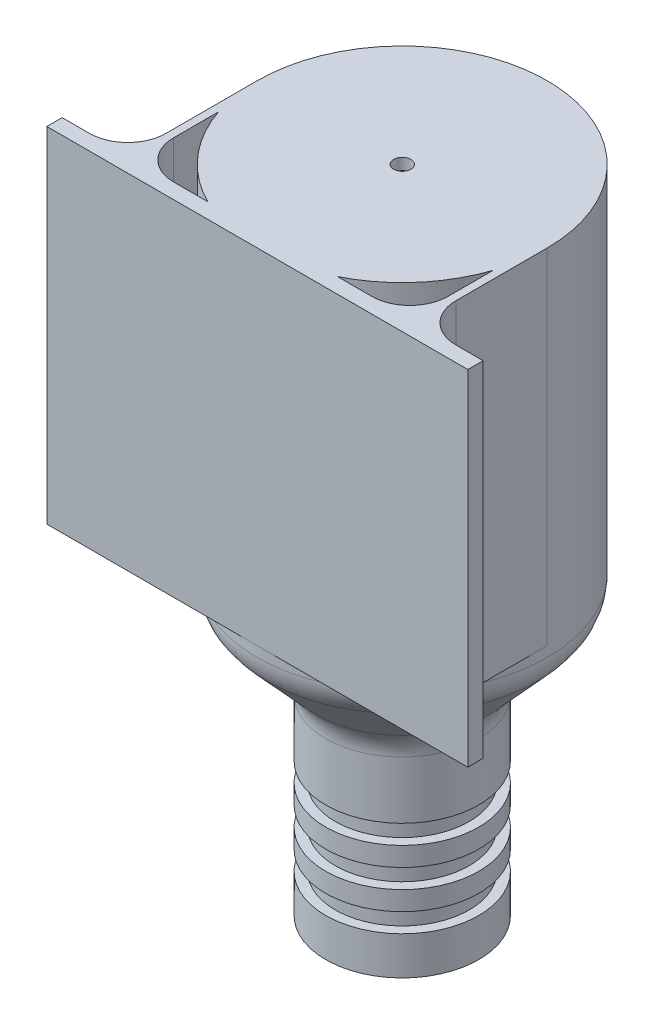
ISO-10303-21;
HEADER;
FILE_DESCRIPTION(('STEP AP214'),'2;1');
FILE_NAME('part.step','',(''),(''),'','','');
FILE_SCHEMA(('AUTOMOTIVE_DESIGN { 1 0 10303 214 1 1 1 1 }'));
ENDSEC;
DATA;
#1=APPLICATION_CONTEXT('core data for automotive mechanical design processes');
#2=APPLICATION_PROTOCOL_DEFINITION('international standard','automotive_design',2000,#1);
#3=PRODUCT_CONTEXT('',#1,'mechanical');
#4=PRODUCT('Part','Part','',(#3));
#5=PRODUCT_RELATED_PRODUCT_CATEGORY('part','',(#4));
#6=PRODUCT_DEFINITION_FORMATION('','',#4);
#7=PRODUCT_DEFINITION_CONTEXT('part definition',#1,'design');
#8=PRODUCT_DEFINITION('design','',#6,#7);
#9=PRODUCT_DEFINITION_SHAPE('','',#8);
#10=(LENGTH_UNIT() NAMED_UNIT(*) SI_UNIT(.MILLI.,.METRE.));
#11=(NAMED_UNIT(*) PLANE_ANGLE_UNIT() SI_UNIT($,.RADIAN.));
#12=(NAMED_UNIT(*) SI_UNIT($,.STERADIAN.) SOLID_ANGLE_UNIT());
#13=UNCERTAINTY_MEASURE_WITH_UNIT(LENGTH_MEASURE(1.E-05),#10,'distance_accuracy_value','');
#14=(GEOMETRIC_REPRESENTATION_CONTEXT(3) GLOBAL_UNCERTAINTY_ASSIGNED_CONTEXT((#13)) GLOBAL_UNIT_ASSIGNED_CONTEXT((#10,
#11,#12)) REPRESENTATION_CONTEXT('',''));
#15=CARTESIAN_POINT('',(0.,0.,0.));
#16=DIRECTION('',(0.,0.,1.));
#17=DIRECTION('',(1.,0.,0.));
#18=AXIS2_PLACEMENT_3D('',#15,#16,#17);
#19=CARTESIAN_POINT('',(0.,-59.8967644363856,0.));
#20=DIRECTION('',(0.,1.,0.));
#21=DIRECTION('',(-1.,0.,0.));
#22=AXIS2_PLACEMENT_3D('',#19,#20,#21);
#23=CYLINDRICAL_SURFACE('',#22,35.8731013826736);
#24=CARTESIAN_POINT('',(0.,-129.659355932698,0.));
#25=DIRECTION('',(0.,1.,0.));
#26=DIRECTION('',(-1.,0.,0.));
#27=AXIS2_PLACEMENT_3D('',#24,#25,#26);
#28=CIRCLE('',#27,35.8731013826736);
#29=CARTESIAN_POINT('',(-35.8731013826736,-129.659355932698,0.));
#30=VERTEX_POINT('',#29);
#31=EDGE_CURVE('E430',#30,#30,#28,.T.);
#32=ORIENTED_EDGE('',*,*,#31,.F.);
#33=EDGE_LOOP('',(#32));
#34=FACE_BOUND('',#33,.T.);
#35=CARTESIAN_POINT('',(0.,-57.4112303872848,0.));
#36=DIRECTION('',(0.,1.,0.));
#37=DIRECTION('',(-1.,0.,0.));
#38=AXIS2_PLACEMENT_3D('',#35,#36,#37);
#39=CIRCLE('',#38,35.8731013826736);
#40=CARTESIAN_POINT('',(-35.8731013826736,-57.4112303872848,0.));
#41=VERTEX_POINT('',#40);
#42=EDGE_CURVE('E206',#41,#41,#39,.T.);
#43=ORIENTED_EDGE('',*,*,#42,.T.);
#44=EDGE_LOOP('',(#43));
#45=FACE_BOUND('',#44,.T.);
#46=ADVANCED_FACE('F45',(#34,#45),#23,.F.);
#47=CARTESIAN_POINT('',(0.,-59.8967644363856,0.));
#48=DIRECTION('',(0.,1.,0.));
#49=DIRECTION('',(-1.,0.,0.));
#50=AXIS2_PLACEMENT_3D('',#47,#48,#49);
#51=CYLINDRICAL_SURFACE('',#50,37.8731013826736);
#52=CARTESIAN_POINT('',(0.,-54.4112303872848,0.));
#53=DIRECTION('',(0.,1.,0.));
#54=DIRECTION('',(-1.,0.,0.));
#55=AXIS2_PLACEMENT_3D('',#52,#53,#54);
#56=CIRCLE('',#55,37.8731013826736);
#57=CARTESIAN_POINT('',(37.8731013826737,-54.4112303872848,0.));
#58=VERTEX_POINT('',#57);
#59=CARTESIAN_POINT('',(-37.8731013826736,-54.4112303872848,-1.21089074646467E-13));
#60=VERTEX_POINT('',#59);
#61=EDGE_CURVE('E434',#58,#60,#56,.T.);
#62=ORIENTED_EDGE('',*,*,#61,.F.);
#63=DIRECTION('',(0.,1.,0.));
#64=VECTOR('',#63,1.);
#65=CARTESIAN_POINT('',(37.8731013826736,-144.411230387285,1.38777878078144E-13));
#66=LINE('',#65,#64);
#67=CARTESIAN_POINT('',(37.8731013826736,-144.411230387285,1.38777878078144E-13));
#68=VERTEX_POINT('',#67);
#69=EDGE_CURVE('E61',#68,#58,#66,.T.);
#70=ORIENTED_EDGE('',*,*,#69,.F.);
#71=CARTESIAN_POINT('',(0.,-144.411230387285,0.));
#72=DIRECTION('',(0.,1.,0.));
#73=DIRECTION('',(-1.,0.,0.));
#74=AXIS2_PLACEMENT_3D('',#71,#72,#73);
#75=CIRCLE('',#74,37.8731013826736);
#76=CARTESIAN_POINT('',(35.8731013826737,-144.411230387285,12.1446451381127));
#77=VERTEX_POINT('',#76);
#78=EDGE_CURVE('E183',#77,#68,#75,.T.);
#79=ORIENTED_EDGE('',*,*,#78,.F.);
#80=DIRECTION('',(0.,1.,0.));
#81=VECTOR('',#80,1.);
#82=CARTESIAN_POINT('',(35.8731013826737,-144.411230387285,12.1446451381127));
#83=LINE('',#82,#81);
#84=CARTESIAN_POINT('',(35.8731013826737,-54.4112303872848,12.1446451381127));
#85=VERTEX_POINT('',#84);
#86=EDGE_CURVE('E352',#77,#85,#83,.T.);
#87=ORIENTED_EDGE('',*,*,#86,.T.);
#88=CARTESIAN_POINT('',(16.940626052817,-54.4112303872848,33.8731013826737));
#89=VERTEX_POINT('',#88);
#90=EDGE_CURVE('E438',#89,#85,#56,.T.);
#91=ORIENTED_EDGE('',*,*,#90,.F.);
#92=DIRECTION('',(0.,1.,0.));
#93=VECTOR('',#92,1.);
#94=CARTESIAN_POINT('',(16.940626052817,-59.8967644363856,33.8731013826737));
#95=LINE('',#94,#93);
#96=CARTESIAN_POINT('',(16.940626052817,-144.411230387285,33.8731013826737));
#97=VERTEX_POINT('',#96);
#98=EDGE_CURVE('E311',#89,#97,#95,.F.);
#99=ORIENTED_EDGE('',*,*,#98,.T.);
#100=CARTESIAN_POINT('',(0.,-144.411230387285,0.));
#101=DIRECTION('',(0.,1.,0.));
#102=DIRECTION('',(-1.,0.,0.));
#103=AXIS2_PLACEMENT_3D('',#100,#101,#102);
#104=CIRCLE('',#103,37.8731013826736);
#105=CARTESIAN_POINT('',(0.,-144.411230387285,37.8731013826737));
#106=VERTEX_POINT('',#105);
#107=EDGE_CURVE('E54',#106,#97,#104,.T.);
#108=ORIENTED_EDGE('',*,*,#107,.F.);
#109=CARTESIAN_POINT('',(-16.9406260528171,-144.411230387285,33.8731013826736));
#110=VERTEX_POINT('',#109);
#111=EDGE_CURVE('E11',#110,#106,#104,.T.);
#112=ORIENTED_EDGE('',*,*,#111,.F.);
#113=DIRECTION('',(0.,1.,0.));
#114=VECTOR('',#113,1.);
#115=CARTESIAN_POINT('',(-16.9406260528172,-59.8967644363856,33.8731013826736));
#116=LINE('',#115,#114);
#117=CARTESIAN_POINT('',(-16.9406260528171,-54.4112303872848,33.8731013826736));
#118=VERTEX_POINT('',#117);
#119=EDGE_CURVE('E359',#110,#118,#116,.T.);
#120=ORIENTED_EDGE('',*,*,#119,.T.);
#121=CARTESIAN_POINT('',(-35.8731013826736,-54.4112303872848,12.144645138113));
#122=VERTEX_POINT('',#121);
#123=EDGE_CURVE('E439',#122,#118,#56,.T.);
#124=ORIENTED_EDGE('',*,*,#123,.F.);
#125=DIRECTION('',(0.,1.,0.));
#126=VECTOR('',#125,1.);
#127=CARTESIAN_POINT('',(-35.8731013826736,-144.411230387285,12.144645138113));
#128=LINE('',#127,#126);
#129=CARTESIAN_POINT('',(-35.8731013826736,-144.411230387285,12.144645138113));
#130=VERTEX_POINT('',#129);
#131=EDGE_CURVE('E335',#130,#122,#128,.T.);
#132=ORIENTED_EDGE('',*,*,#131,.F.);
#133=CARTESIAN_POINT('',(0.,-144.411230387285,0.));
#134=DIRECTION('',(0.,1.,0.));
#135=DIRECTION('',(-1.,0.,0.));
#136=AXIS2_PLACEMENT_3D('',#133,#134,#135);
#137=CIRCLE('',#136,37.8731013826736);
#138=CARTESIAN_POINT('',(-37.8731013826736,-144.411230387285,-1.21089074646467E-13));
#139=VERTEX_POINT('',#138);
#140=EDGE_CURVE('E232',#139,#130,#137,.T.);
#141=ORIENTED_EDGE('',*,*,#140,.F.);
#142=DIRECTION('',(0.,1.,0.));
#143=VECTOR('',#142,1.);
#144=CARTESIAN_POINT('',(-37.8731013826736,-144.411230387285,-1.21089074646467E-13));
#145=LINE('',#144,#143);
#146=EDGE_CURVE('E332',#139,#60,#145,.T.);
#147=ORIENTED_EDGE('',*,*,#146,.T.);
#148=EDGE_LOOP('',(#62,#70,#79,#87,#91,#99,#108,#112,#120,#124,#132,#141,#147));
#149=FACE_BOUND('',#148,.T.);
#150=CARTESIAN_POINT('',(0.,-147.078195730755,0.));
#151=DIRECTION('',(0.,1.,0.));
#152=DIRECTION('',(-1.,0.,0.));
#153=AXIS2_PLACEMENT_3D('',#150,#151,#152);
#154=CIRCLE('',#153,37.8731013826736);
#155=CARTESIAN_POINT('',(-37.8731013826736,-147.078195730755,0.));
#156=VERTEX_POINT('',#155);
#157=EDGE_CURVE('E440',#156,#156,#154,.T.);
#158=ORIENTED_EDGE('',*,*,#157,.T.);
#159=EDGE_LOOP('',(#158));
#160=FACE_BOUND('',#159,.T.);
#161=ADVANCED_FACE('F475',(#149,#160),#51,.T.);
#162=CARTESIAN_POINT('',(0.,-59.8967644363856,0.));
#163=DIRECTION('',(0.,1.,0.));
#164=DIRECTION('',(-1.,0.,0.));
#165=AXIS2_PLACEMENT_3D('',#162,#163,#164);
#166=CYLINDRICAL_SURFACE('',#165,20.);
#167=CARTESIAN_POINT('',(0.,-174.411230387285,0.));
#168=DIRECTION('',(0.,1.,0.));
#169=DIRECTION('',(-1.,0.,0.));
#170=AXIS2_PLACEMENT_3D('',#167,#168,#169);
#171=CIRCLE('',#170,20.);
#172=CARTESIAN_POINT('',(-20.,-174.411230387285,0.));
#173=VERTEX_POINT('',#172);
#174=EDGE_CURVE('E451',#173,#173,#171,.T.);
#175=ORIENTED_EDGE('',*,*,#174,.F.);
#176=EDGE_LOOP('',(#175));
#177=FACE_BOUND('',#176,.T.);
#178=CARTESIAN_POINT('',(0.,-189.411230387285,0.));
#179=DIRECTION('',(0.,1.,0.));
#180=DIRECTION('',(-1.,0.,0.));
#181=AXIS2_PLACEMENT_3D('',#178,#179,#180);
#182=CIRCLE('',#181,20.);
#183=CARTESIAN_POINT('',(-20.,-189.411230387285,0.));
#184=VERTEX_POINT('',#183);
#185=EDGE_CURVE('E362',#184,#184,#182,.T.);
#186=ORIENTED_EDGE('',*,*,#185,.T.);
#187=EDGE_LOOP('',(#186));
#188=FACE_BOUND('',#187,.T.);
#189=ADVANCED_FACE('F47',(#177,#188),#166,.T.);
#190=CARTESIAN_POINT('',(0.,-174.411230387285,0.));
#191=DIRECTION('',(0.,1.,0.));
#192=DIRECTION('',(-1.,0.,0.));
#193=AXIS2_PLACEMENT_3D('',#190,#191,#192);
#194=TOROIDAL_SURFACE('',#193,30.,9.99999999999999);
#195=CARTESIAN_POINT('',(0.,-167.668738262499,0.));
#196=DIRECTION('',(0.,1.,0.));
#197=DIRECTION('',(-1.,0.,0.));
#198=AXIS2_PLACEMENT_3D('',#195,#196,#197);
#199=CIRCLE('',#198,22.6149610734129);
#200=CARTESIAN_POINT('',(-22.6149610734129,-167.668738262499,0.));
#201=VERTEX_POINT('',#200);
#202=EDGE_CURVE('E448',#201,#201,#199,.T.);
#203=ORIENTED_EDGE('',*,*,#202,.F.);
#204=EDGE_LOOP('',(#203));
#205=FACE_BOUND('',#204,.T.);
#206=ORIENTED_EDGE('',*,*,#174,.T.);
#207=EDGE_LOOP('',(#206));
#208=FACE_BOUND('',#207,.T.);
#209=ADVANCED_FACE('F561',(#205,#208),#194,.F.);
#210=CARTESIAN_POINT('',(0.,-167.668738262499,0.));
#211=DIRECTION('',(0.,1.,0.));
#212=DIRECTION('',(-1.,0.,0.));
#213=AXIS2_PLACEMENT_3D('',#210,#211,#212);
#214=CONICAL_SURFACE('',#213,22.6149610734129,0.739947596653468);
#215=CARTESIAN_POINT('',(0.,-153.82068785554,0.));
#216=DIRECTION('',(0.,1.,0.));
#217=DIRECTION('',(-1.,0.,0.));
#218=AXIS2_PLACEMENT_3D('',#215,#216,#217);
#219=CIRCLE('',#218,35.2581403092607);
#220=CARTESIAN_POINT('',(-35.2581403092606,-153.82068785554,0.));
#221=VERTEX_POINT('',#220);
#222=EDGE_CURVE('E444',#221,#221,#219,.T.);
#223=ORIENTED_EDGE('',*,*,#222,.F.);
#224=EDGE_LOOP('',(#223));
#225=FACE_BOUND('',#224,.T.);
#226=ORIENTED_EDGE('',*,*,#202,.T.);
#227=EDGE_LOOP('',(#226));
#228=FACE_BOUND('',#227,.T.);
#229=ADVANCED_FACE('F558',(#225,#228),#214,.T.);
#230=CARTESIAN_POINT('',(0.,-147.078195730755,0.));
#231=DIRECTION('',(0.,1.,0.));
#232=DIRECTION('',(-1.,0.,0.));
#233=AXIS2_PLACEMENT_3D('',#230,#231,#232);
#234=TOROIDAL_SURFACE('',#233,27.8731013826736,10.);
#235=ORIENTED_EDGE('',*,*,#157,.F.);
#236=EDGE_LOOP('',(#235));
#237=FACE_BOUND('',#236,.T.);
#238=ORIENTED_EDGE('',*,*,#222,.T.);
#239=EDGE_LOOP('',(#238));
#240=FACE_BOUND('',#239,.T.);
#241=ADVANCED_FACE('F554',(#237,#240),#234,.T.);
#242=CARTESIAN_POINT('',(0.,-54.4112303872848,0.));
#243=DIRECTION('',(0.,-1.,0.));
#244=DIRECTION('',(1.,0.,0.));
#245=AXIS2_PLACEMENT_3D('',#242,#243,#244);
#246=PLANE('',#245);
#247=ORIENTED_EDGE('',*,*,#90,.T.);
#248=DIRECTION('',(0.,0.,-1.));
#249=VECTOR('',#248,1.);
#250=CARTESIAN_POINT('',(35.8731013826737,-54.4112303872848,0.));
#251=LINE('',#250,#249);
#252=CARTESIAN_POINT('',(35.8731013826737,-54.4112303872848,23.8731013826736));
#253=VERTEX_POINT('',#252);
#254=EDGE_CURVE('E267',#253,#85,#251,.T.);
#255=ORIENTED_EDGE('',*,*,#254,.F.);
#256=CARTESIAN_POINT('',(25.8731013826737,-54.4112303872848,23.8731013826737));
#257=DIRECTION('',(0.,1.,0.));
#258=DIRECTION('',(-1.,0.,0.));
#259=AXIS2_PLACEMENT_3D('',#256,#257,#258);
#260=CIRCLE('',#259,10.);
#261=CARTESIAN_POINT('',(25.8731013826736,-54.4112303872848,33.8731013826737));
#262=VERTEX_POINT('',#261);
#263=EDGE_CURVE('E271',#262,#253,#260,.T.);
#264=ORIENTED_EDGE('',*,*,#263,.F.);
#265=DIRECTION('',(-1.,0.,0.));
#266=VECTOR('',#265,1.);
#267=CARTESIAN_POINT('',(0.,-54.4112303872848,33.8731013826737));
#268=LINE('',#267,#266);
#269=EDGE_CURVE('E69',#262,#89,#268,.T.);
#270=ORIENTED_EDGE('',*,*,#269,.T.);
#271=EDGE_LOOP('',(#247,#255,#264,#270));
#272=FACE_BOUND('',#271,.T.);
#273=ORIENTED_EDGE('',*,*,#123,.T.);
#274=DIRECTION('',(-1.,0.,0.));
#275=VECTOR('',#274,1.);
#276=CARTESIAN_POINT('',(0.,-54.4112303872848,33.8731013826737));
#277=LINE('',#276,#275);
#278=CARTESIAN_POINT('',(-25.8731013826736,-54.4112303872848,33.8731013826736));
#279=VERTEX_POINT('',#278);
#280=EDGE_CURVE('E276',#118,#279,#277,.T.);
#281=ORIENTED_EDGE('',*,*,#280,.T.);
#282=CARTESIAN_POINT('',(-25.8731013826737,-54.4112303872848,23.8731013826736));
#283=DIRECTION('',(0.,1.,0.));
#284=DIRECTION('',(-1.,0.,0.));
#285=AXIS2_PLACEMENT_3D('',#282,#283,#284);
#286=CIRCLE('',#285,10.);
#287=CARTESIAN_POINT('',(-35.8731013826737,-54.4112303872848,23.8731013826735));
#288=VERTEX_POINT('',#287);
#289=EDGE_CURVE('E279',#279,#288,#286,.F.);
#290=ORIENTED_EDGE('',*,*,#289,.T.);
#291=DIRECTION('',(0.,0.,-1.));
#292=VECTOR('',#291,1.);
#293=CARTESIAN_POINT('',(-35.8731013826736,-54.4112303872848,-1.14694611545969E-13));
#294=LINE('',#293,#292);
#295=EDGE_CURVE('E283',#288,#122,#294,.T.);
#296=ORIENTED_EDGE('',*,*,#295,.T.);
#297=EDGE_LOOP('',(#273,#281,#290,#296));
#298=FACE_BOUND('',#297,.T.);
#299=DIRECTION('',(1.,0.,0.));
#300=VECTOR('',#299,1.);
#301=CARTESIAN_POINT('',(0.,-54.4112303872848,37.8731013826737));
#302=LINE('',#301,#300);
#303=CARTESIAN_POINT('',(-55.,-54.4112303872848,37.8731013826736));
#304=VERTEX_POINT('',#303);
#305=CARTESIAN_POINT('',(55.,-54.4112303872848,37.8731013826738));
#306=VERTEX_POINT('',#305);
#307=EDGE_CURVE('E303',#304,#306,#302,.T.);
#308=ORIENTED_EDGE('',*,*,#307,.T.);
#309=DIRECTION('',(0.,0.,1.));
#310=VECTOR('',#309,1.);
#311=CARTESIAN_POINT('',(55.0000000000001,-54.4112303872848,1.90819582357449E-13));
#312=LINE('',#311,#310);
#313=CARTESIAN_POINT('',(55.,-54.4112303872848,33.8731013826738));
#314=VERTEX_POINT('',#313);
#315=EDGE_CURVE('E203',#314,#306,#312,.T.);
#316=ORIENTED_EDGE('',*,*,#315,.F.);
#317=DIRECTION('',(1.,0.,0.));
#318=VECTOR('',#317,1.);
#319=CARTESIAN_POINT('',(-1.25459116536479E-13,-54.4112303872848,33.8731013826736));
#320=LINE('',#319,#318);
#321=CARTESIAN_POINT('',(47.8731013826738,-54.4112303872848,33.8731013826738));
#322=VERTEX_POINT('',#321);
#323=EDGE_CURVE('E200',#322,#314,#320,.T.);
#324=ORIENTED_EDGE('',*,*,#323,.F.);
#325=CARTESIAN_POINT('',(47.8731013826737,-54.4112303872848,23.8731013826738));
#326=DIRECTION('',(0.,1.,0.));
#327=DIRECTION('',(-1.,0.,0.));
#328=AXIS2_PLACEMENT_3D('',#325,#326,#327);
#329=CIRCLE('',#328,9.99999999999999);
#330=CARTESIAN_POINT('',(37.8731013826737,-54.4112303872848,23.8731013826737));
#331=VERTEX_POINT('',#330);
#332=EDGE_CURVE('E262',#331,#322,#329,.T.);
#333=ORIENTED_EDGE('',*,*,#332,.F.);
#334=DIRECTION('',(0.,0.,1.));
#335=VECTOR('',#334,1.);
#336=CARTESIAN_POINT('',(37.8731013826737,-54.4112303872848,0.));
#337=LINE('',#336,#335);
#338=EDGE_CURVE('E189',#58,#331,#337,.T.);
#339=ORIENTED_EDGE('',*,*,#338,.F.);
#340=ORIENTED_EDGE('',*,*,#61,.T.);
#341=DIRECTION('',(0.,0.,1.));
#342=VECTOR('',#341,1.);
#343=CARTESIAN_POINT('',(-37.8731013826736,-54.4112303872848,-1.21089074646467E-13));
#344=LINE('',#343,#342);
#345=CARTESIAN_POINT('',(-37.8731013826737,-54.4112303872848,23.8731013826736));
#346=VERTEX_POINT('',#345);
#347=EDGE_CURVE('E287',#60,#346,#344,.T.);
#348=ORIENTED_EDGE('',*,*,#347,.T.);
#349=CARTESIAN_POINT('',(-47.8731013826737,-54.4112303872848,23.8731013826736));
#350=DIRECTION('',(0.,1.,0.));
#351=DIRECTION('',(-1.,0.,0.));
#352=AXIS2_PLACEMENT_3D('',#349,#350,#351);
#353=CIRCLE('',#352,10.);
#354=CARTESIAN_POINT('',(-47.8731013826737,-54.4112303872848,33.8731013826736));
#355=VERTEX_POINT('',#354);
#356=EDGE_CURVE('E291',#346,#355,#353,.F.);
#357=ORIENTED_EDGE('',*,*,#356,.T.);
#358=DIRECTION('',(-1.,0.,0.));
#359=VECTOR('',#358,1.);
#360=CARTESIAN_POINT('',(0.,-54.4112303872848,33.8731013826736));
#361=LINE('',#360,#359);
#362=CARTESIAN_POINT('',(-55.,-54.4112303872848,33.8731013826736));
#363=VERTEX_POINT('',#362);
#364=EDGE_CURVE('E295',#355,#363,#361,.T.);
#365=ORIENTED_EDGE('',*,*,#364,.T.);
#366=DIRECTION('',(0.,0.,1.));
#367=VECTOR('',#366,1.);
#368=CARTESIAN_POINT('',(-55.,-54.4112303872848,0.));
#369=LINE('',#368,#367);
#370=EDGE_CURVE('E299',#363,#304,#369,.T.);
#371=ORIENTED_EDGE('',*,*,#370,.T.);
#372=EDGE_LOOP('',(#308,#316,#324,#333,#339,#340,#348,#357,#365,#371));
#373=FACE_BOUND('',#372,.T.);
#374=CARTESIAN_POINT('',(0.,-54.4112303872848,0.));
#375=DIRECTION('',(0.,1.,0.));
#376=DIRECTION('',(-1.,0.,0.));
#377=AXIS2_PLACEMENT_3D('',#374,#375,#376);
#378=CIRCLE('',#377,2.25);
#379=CARTESIAN_POINT('',(-2.25,-54.4112303872848,0.));
#380=VERTEX_POINT('',#379);
#381=EDGE_CURVE('E1080',#380,#380,#378,.T.);
#382=ORIENTED_EDGE('',*,*,#381,.F.);
#383=EDGE_LOOP('',(#382));
#384=FACE_BOUND('',#383,.T.);
#385=ADVANCED_FACE('F480',(#272,#298,#373,#384),#246,.F.);
#386=CARTESIAN_POINT('',(0.,-129.659355932698,0.));
#387=DIRECTION('',(0.,1.,0.));
#388=DIRECTION('',(-1.,0.,0.));
#389=AXIS2_PLACEMENT_3D('',#386,#387,#388);
#390=DEGENERATE_TOROIDAL_SURFACE('',#389,14.1268986173264,50.,.F.);
#391=ORIENTED_EDGE('',*,*,#31,.T.);
#392=EDGE_LOOP('',(#391));
#393=FACE_BOUND('',#392,.T.);
#394=CARTESIAN_POINT('',(0.,-165.712630367558,0.));
#395=DIRECTION('',(0.,1.,0.));
#396=DIRECTION('',(-1.,0.,0.));
#397=AXIS2_PLACEMENT_3D('',#394,#395,#396);
#398=CIRCLE('',#397,20.516447100497);
#399=CARTESIAN_POINT('',(-20.516447100497,-165.712630367558,0.));
#400=VERTEX_POINT('',#399);
#401=EDGE_CURVE('E426',#400,#400,#398,.T.);
#402=ORIENTED_EDGE('',*,*,#401,.F.);
#403=EDGE_LOOP('',(#402));
#404=FACE_BOUND('',#403,.T.);
#405=ADVANCED_FACE('F551',(#393,#404),#390,.T.);
#406=CARTESIAN_POINT('',(0.,-167.581679311396,0.));
#407=DIRECTION('',(0.,1.,0.));
#408=DIRECTION('',(-1.,0.,0.));
#409=AXIS2_PLACEMENT_3D('',#406,#407,#408);
#410=CONICAL_SURFACE('',#409,18.5713308564353,0.805338888020652);
#411=ORIENTED_EDGE('',*,*,#401,.T.);
#412=EDGE_LOOP('',(#411));
#413=FACE_BOUND('',#412,.T.);
#414=CARTESIAN_POINT('',(0.,-167.581679311396,0.));
#415=DIRECTION('',(0.,1.,0.));
#416=DIRECTION('',(-1.,0.,0.));
#417=AXIS2_PLACEMENT_3D('',#414,#415,#416);
#418=CIRCLE('',#417,18.5713308564353);
#419=CARTESIAN_POINT('',(-18.5713308564353,-167.581679311396,0.));
#420=VERTEX_POINT('',#419);
#421=EDGE_CURVE('E422',#420,#420,#418,.T.);
#422=ORIENTED_EDGE('',*,*,#421,.F.);
#423=EDGE_LOOP('',(#422));
#424=FACE_BOUND('',#423,.T.);
#425=ADVANCED_FACE('F662',(#413,#424),#410,.F.);
#426=CARTESIAN_POINT('',(0.,-174.792334198368,0.));
#427=DIRECTION('',(0.,1.,0.));
#428=DIRECTION('',(-1.,0.,0.));
#429=AXIS2_PLACEMENT_3D('',#426,#427,#428);
#430=TOROIDAL_SURFACE('',#429,25.5,9.99999999999999);
#431=ORIENTED_EDGE('',*,*,#421,.T.);
#432=EDGE_LOOP('',(#431));
#433=FACE_BOUND('',#432,.T.);
#434=CARTESIAN_POINT('',(0.,-174.792334198368,0.));
#435=DIRECTION('',(0.,1.,0.));
#436=DIRECTION('',(-1.,0.,0.));
#437=AXIS2_PLACEMENT_3D('',#434,#435,#436);
#438=CIRCLE('',#437,15.5);
#439=CARTESIAN_POINT('',(-15.5,-174.792334198368,0.));
#440=VERTEX_POINT('',#439);
#441=EDGE_CURVE('E418',#440,#440,#438,.T.);
#442=ORIENTED_EDGE('',*,*,#441,.F.);
#443=EDGE_LOOP('',(#442));
#444=FACE_BOUND('',#443,.T.);
#445=ADVANCED_FACE('F656',(#433,#444),#430,.T.);
#446=CARTESIAN_POINT('',(0.,-59.8967644363856,0.));
#447=DIRECTION('',(0.,1.,0.));
#448=DIRECTION('',(-1.,0.,0.));
#449=AXIS2_PLACEMENT_3D('',#446,#447,#448);
#450=CYLINDRICAL_SURFACE('',#449,15.5);
#451=ORIENTED_EDGE('',*,*,#441,.T.);
#452=EDGE_LOOP('',(#451));
#453=FACE_BOUND('',#452,.T.);
#454=CARTESIAN_POINT('',(0.,-224.411230387285,0.));
#455=DIRECTION('',(0.,1.,0.));
#456=DIRECTION('',(-1.,0.,0.));
#457=AXIS2_PLACEMENT_3D('',#454,#455,#456);
#458=CIRCLE('',#457,15.5);
#459=CARTESIAN_POINT('',(-15.5,-224.411230387285,0.));
#460=VERTEX_POINT('',#459);
#461=EDGE_CURVE('E414',#460,#460,#458,.T.);
#462=ORIENTED_EDGE('',*,*,#461,.F.);
#463=EDGE_LOOP('',(#462));
#464=FACE_BOUND('',#463,.T.);
#465=ADVANCED_FACE('F651',(#453,#464),#450,.F.);
#466=CARTESIAN_POINT('',(-1.38414730533568E-12,-224.411230387285,0.));
#467=DIRECTION('',(0.,1.,0.));
#468=DIRECTION('',(-1.,0.,0.));
#469=AXIS2_PLACEMENT_3D('',#466,#467,#468);
#470=PLANE('',#469);
#471=CARTESIAN_POINT('',(0.,-224.411230387285,0.));
#472=DIRECTION('',(0.,1.,0.));
#473=DIRECTION('',(-1.,0.,0.));
#474=AXIS2_PLACEMENT_3D('',#471,#472,#473);
#475=CIRCLE('',#474,20.);
#476=CARTESIAN_POINT('',(-20.,-224.411230387285,0.));
#477=VERTEX_POINT('',#476);
#478=EDGE_CURVE('E410',#477,#477,#475,.T.);
#479=ORIENTED_EDGE('',*,*,#478,.F.);
#480=EDGE_LOOP('',(#479));
#481=FACE_BOUND('',#480,.T.);
#482=ORIENTED_EDGE('',*,*,#461,.T.);
#483=EDGE_LOOP('',(#482));
#484=FACE_BOUND('',#483,.T.);
#485=ADVANCED_FACE('F645',(#481,#484),#470,.F.);
#486=CARTESIAN_POINT('',(0.,-59.8967644363856,0.));
#487=DIRECTION('',(0.,1.,0.));
#488=DIRECTION('',(-1.,0.,0.));
#489=AXIS2_PLACEMENT_3D('',#486,#487,#488);
#490=CYLINDRICAL_SURFACE('',#489,20.);
#491=CARTESIAN_POINT('',(0.,-214.411230387285,0.));
#492=DIRECTION('',(0.,1.,0.));
#493=DIRECTION('',(-1.,0.,0.));
#494=AXIS2_PLACEMENT_3D('',#491,#492,#493);
#495=CIRCLE('',#494,20.);
#496=CARTESIAN_POINT('',(-20.,-214.411230387285,0.));
#497=VERTEX_POINT('',#496);
#498=EDGE_CURVE('E406',#497,#497,#495,.T.);
#499=ORIENTED_EDGE('',*,*,#498,.F.);
#500=EDGE_LOOP('',(#499));
#501=FACE_BOUND('',#500,.T.);
#502=ORIENTED_EDGE('',*,*,#478,.T.);
#503=EDGE_LOOP('',(#502));
#504=FACE_BOUND('',#503,.T.);
#505=ADVANCED_FACE('F639',(#501,#504),#490,.T.);
#506=CARTESIAN_POINT('',(0.,-214.411230387285,0.));
#507=DIRECTION('',(0.,-1.,0.));
#508=DIRECTION('',(1.,0.,0.));
#509=AXIS2_PLACEMENT_3D('',#506,#507,#508);
#510=PLANE('',#509);
#511=CARTESIAN_POINT('',(0.,-214.411230387285,0.));
#512=DIRECTION('',(0.,1.,0.));
#513=DIRECTION('',(-1.,0.,0.));
#514=AXIS2_PLACEMENT_3D('',#511,#512,#513);
#515=CIRCLE('',#514,17.5);
#516=CARTESIAN_POINT('',(-17.5,-214.411230387285,0.));
#517=VERTEX_POINT('',#516);
#518=EDGE_CURVE('E402',#517,#517,#515,.T.);
#519=ORIENTED_EDGE('',*,*,#518,.F.);
#520=EDGE_LOOP('',(#519));
#521=FACE_BOUND('',#520,.T.);
#522=ORIENTED_EDGE('',*,*,#498,.T.);
#523=EDGE_LOOP('',(#522));
#524=FACE_BOUND('',#523,.T.);
#525=ADVANCED_FACE('F633',(#521,#524),#510,.F.);
#526=CARTESIAN_POINT('',(0.,-59.8967644363856,0.));
#527=DIRECTION('',(0.,1.,0.));
#528=DIRECTION('',(-1.,0.,0.));
#529=AXIS2_PLACEMENT_3D('',#526,#527,#528);
#530=CYLINDRICAL_SURFACE('',#529,17.5);
#531=CARTESIAN_POINT('',(0.,-209.411230387285,0.));
#532=DIRECTION('',(0.,1.,0.));
#533=DIRECTION('',(-1.,0.,0.));
#534=AXIS2_PLACEMENT_3D('',#531,#532,#533);
#535=CIRCLE('',#534,17.5);
#536=CARTESIAN_POINT('',(-17.5,-209.411230387285,0.));
#537=VERTEX_POINT('',#536);
#538=EDGE_CURVE('E398',#537,#537,#535,.T.);
#539=ORIENTED_EDGE('',*,*,#538,.F.);
#540=EDGE_LOOP('',(#539));
#541=FACE_BOUND('',#540,.T.);
#542=ORIENTED_EDGE('',*,*,#518,.T.);
#543=EDGE_LOOP('',(#542));
#544=FACE_BOUND('',#543,.T.);
#545=ADVANCED_FACE('F627',(#541,#544),#530,.T.);
#546=CARTESIAN_POINT('',(0.,-209.411230387285,0.));
#547=DIRECTION('',(0.,1.,0.));
#548=DIRECTION('',(-1.,0.,0.));
#549=AXIS2_PLACEMENT_3D('',#546,#547,#548);
#550=PLANE('',#549);
#551=CARTESIAN_POINT('',(0.,-209.411230387285,0.));
#552=DIRECTION('',(0.,1.,0.));
#553=DIRECTION('',(-1.,0.,0.));
#554=AXIS2_PLACEMENT_3D('',#551,#552,#553);
#555=CIRCLE('',#554,20.);
#556=CARTESIAN_POINT('',(-20.,-209.411230387285,0.));
#557=VERTEX_POINT('',#556);
#558=EDGE_CURVE('E394',#557,#557,#555,.T.);
#559=ORIENTED_EDGE('',*,*,#558,.F.);
#560=EDGE_LOOP('',(#559));
#561=FACE_BOUND('',#560,.T.);
#562=ORIENTED_EDGE('',*,*,#538,.T.);
#563=EDGE_LOOP('',(#562));
#564=FACE_BOUND('',#563,.T.);
#565=ADVANCED_FACE('F621',(#561,#564),#550,.F.);
#566=CARTESIAN_POINT('',(0.,-59.8967644363856,0.));
#567=DIRECTION('',(0.,1.,0.));
#568=DIRECTION('',(-1.,0.,0.));
#569=AXIS2_PLACEMENT_3D('',#566,#567,#568);
#570=CYLINDRICAL_SURFACE('',#569,20.);
#571=CARTESIAN_POINT('',(0.,-204.411230387285,0.));
#572=DIRECTION('',(0.,1.,0.));
#573=DIRECTION('',(-1.,0.,0.));
#574=AXIS2_PLACEMENT_3D('',#571,#572,#573);
#575=CIRCLE('',#574,20.);
#576=CARTESIAN_POINT('',(-20.,-204.411230387285,0.));
#577=VERTEX_POINT('',#576);
#578=EDGE_CURVE('E390',#577,#577,#575,.T.);
#579=ORIENTED_EDGE('',*,*,#578,.F.);
#580=EDGE_LOOP('',(#579));
#581=FACE_BOUND('',#580,.T.);
#582=ORIENTED_EDGE('',*,*,#558,.T.);
#583=EDGE_LOOP('',(#582));
#584=FACE_BOUND('',#583,.T.);
#585=ADVANCED_FACE('F615',(#581,#584),#570,.T.);
#586=CARTESIAN_POINT('',(0.,-204.411230387285,0.));
#587=DIRECTION('',(0.,-1.,0.));
#588=DIRECTION('',(1.,0.,0.));
#589=AXIS2_PLACEMENT_3D('',#586,#587,#588);
#590=PLANE('',#589);
#591=CARTESIAN_POINT('',(0.,-204.411230387285,0.));
#592=DIRECTION('',(0.,1.,0.));
#593=DIRECTION('',(-1.,0.,0.));
#594=AXIS2_PLACEMENT_3D('',#591,#592,#593);
#595=CIRCLE('',#594,17.5);
#596=CARTESIAN_POINT('',(-17.5,-204.411230387285,0.));
#597=VERTEX_POINT('',#596);
#598=EDGE_CURVE('E386',#597,#597,#595,.T.);
#599=ORIENTED_EDGE('',*,*,#598,.F.);
#600=EDGE_LOOP('',(#599));
#601=FACE_BOUND('',#600,.T.);
#602=ORIENTED_EDGE('',*,*,#578,.T.);
#603=EDGE_LOOP('',(#602));
#604=FACE_BOUND('',#603,.T.);
#605=ADVANCED_FACE('F609',(#601,#604),#590,.F.);
#606=CARTESIAN_POINT('',(0.,-59.8967644363856,0.));
#607=DIRECTION('',(0.,1.,0.));
#608=DIRECTION('',(-1.,0.,0.));
#609=AXIS2_PLACEMENT_3D('',#606,#607,#608);
#610=CYLINDRICAL_SURFACE('',#609,17.5);
#611=CARTESIAN_POINT('',(0.,-199.411230387285,0.));
#612=DIRECTION('',(0.,1.,0.));
#613=DIRECTION('',(-1.,0.,0.));
#614=AXIS2_PLACEMENT_3D('',#611,#612,#613);
#615=CIRCLE('',#614,17.5);
#616=CARTESIAN_POINT('',(-17.5,-199.411230387285,0.));
#617=VERTEX_POINT('',#616);
#618=EDGE_CURVE('E382',#617,#617,#615,.T.);
#619=ORIENTED_EDGE('',*,*,#618,.F.);
#620=EDGE_LOOP('',(#619));
#621=FACE_BOUND('',#620,.T.);
#622=ORIENTED_EDGE('',*,*,#598,.T.);
#623=EDGE_LOOP('',(#622));
#624=FACE_BOUND('',#623,.T.);
#625=ADVANCED_FACE('F603',(#621,#624),#610,.T.);
#626=CARTESIAN_POINT('',(0.,-199.411230387285,0.));
#627=DIRECTION('',(0.,1.,0.));
#628=DIRECTION('',(-1.,0.,0.));
#629=AXIS2_PLACEMENT_3D('',#626,#627,#628);
#630=PLANE('',#629);
#631=CARTESIAN_POINT('',(0.,-199.411230387285,0.));
#632=DIRECTION('',(0.,1.,0.));
#633=DIRECTION('',(-1.,0.,0.));
#634=AXIS2_PLACEMENT_3D('',#631,#632,#633);
#635=CIRCLE('',#634,20.);
#636=CARTESIAN_POINT('',(-20.,-199.411230387285,0.));
#637=VERTEX_POINT('',#636);
#638=EDGE_CURVE('E378',#637,#637,#635,.T.);
#639=ORIENTED_EDGE('',*,*,#638,.F.);
#640=EDGE_LOOP('',(#639));
#641=FACE_BOUND('',#640,.T.);
#642=ORIENTED_EDGE('',*,*,#618,.T.);
#643=EDGE_LOOP('',(#642));
#644=FACE_BOUND('',#643,.T.);
#645=ADVANCED_FACE('F597',(#641,#644),#630,.F.);
#646=CARTESIAN_POINT('',(0.,-59.8967644363856,0.));
#647=DIRECTION('',(0.,1.,0.));
#648=DIRECTION('',(-1.,0.,0.));
#649=AXIS2_PLACEMENT_3D('',#646,#647,#648);
#650=CYLINDRICAL_SURFACE('',#649,20.);
#651=CARTESIAN_POINT('',(0.,-194.411230387285,0.));
#652=DIRECTION('',(0.,1.,0.));
#653=DIRECTION('',(-1.,0.,0.));
#654=AXIS2_PLACEMENT_3D('',#651,#652,#653);
#655=CIRCLE('',#654,20.);
#656=CARTESIAN_POINT('',(-20.,-194.411230387285,0.));
#657=VERTEX_POINT('',#656);
#658=EDGE_CURVE('E374',#657,#657,#655,.T.);
#659=ORIENTED_EDGE('',*,*,#658,.F.);
#660=EDGE_LOOP('',(#659));
#661=FACE_BOUND('',#660,.T.);
#662=ORIENTED_EDGE('',*,*,#638,.T.);
#663=EDGE_LOOP('',(#662));
#664=FACE_BOUND('',#663,.T.);
#665=ADVANCED_FACE('F591',(#661,#664),#650,.T.);
#666=CARTESIAN_POINT('',(-2.15839824221669E-12,-194.411230387285,0.));
#667=DIRECTION('',(0.,-1.,0.));
#668=DIRECTION('',(1.,0.,0.));
#669=AXIS2_PLACEMENT_3D('',#666,#667,#668);
#670=PLANE('',#669);
#671=CARTESIAN_POINT('',(0.,-194.411230387285,0.));
#672=DIRECTION('',(0.,1.,0.));
#673=DIRECTION('',(-1.,0.,0.));
#674=AXIS2_PLACEMENT_3D('',#671,#672,#673);
#675=CIRCLE('',#674,17.5);
#676=CARTESIAN_POINT('',(-17.5,-194.411230387285,0.));
#677=VERTEX_POINT('',#676);
#678=EDGE_CURVE('E370',#677,#677,#675,.T.);
#679=ORIENTED_EDGE('',*,*,#678,.F.);
#680=EDGE_LOOP('',(#679));
#681=FACE_BOUND('',#680,.T.);
#682=ORIENTED_EDGE('',*,*,#658,.T.);
#683=EDGE_LOOP('',(#682));
#684=FACE_BOUND('',#683,.T.);
#685=ADVANCED_FACE('F585',(#681,#684),#670,.F.);
#686=CARTESIAN_POINT('',(0.,-59.8967644363856,0.));
#687=DIRECTION('',(0.,1.,0.));
#688=DIRECTION('',(-1.,0.,0.));
#689=AXIS2_PLACEMENT_3D('',#686,#687,#688);
#690=CYLINDRICAL_SURFACE('',#689,17.5);
#691=CARTESIAN_POINT('',(0.,-189.411230387285,0.));
#692=DIRECTION('',(0.,1.,0.));
#693=DIRECTION('',(-1.,0.,0.));
#694=AXIS2_PLACEMENT_3D('',#691,#692,#693);
#695=CIRCLE('',#694,17.5);
#696=CARTESIAN_POINT('',(-17.5,-189.411230387285,0.));
#697=VERTEX_POINT('',#696);
#698=EDGE_CURVE('E366',#697,#697,#695,.T.);
#699=ORIENTED_EDGE('',*,*,#698,.F.);
#700=EDGE_LOOP('',(#699));
#701=FACE_BOUND('',#700,.T.);
#702=ORIENTED_EDGE('',*,*,#678,.T.);
#703=EDGE_LOOP('',(#702));
#704=FACE_BOUND('',#703,.T.);
#705=ADVANCED_FACE('F579',(#701,#704),#690,.T.);
#706=CARTESIAN_POINT('',(0.,-189.411230387285,0.));
#707=DIRECTION('',(0.,1.,0.));
#708=DIRECTION('',(-1.,0.,0.));
#709=AXIS2_PLACEMENT_3D('',#706,#707,#708);
#710=PLANE('',#709);
#711=ORIENTED_EDGE('',*,*,#185,.F.);
#712=EDGE_LOOP('',(#711));
#713=FACE_BOUND('',#712,.T.);
#714=ORIENTED_EDGE('',*,*,#698,.T.);
#715=EDGE_LOOP('',(#714));
#716=FACE_BOUND('',#715,.T.);
#717=ADVANCED_FACE('F576',(#713,#716),#710,.F.);
#718=CARTESIAN_POINT('',(0.,-144.411230387285,0.));
#719=DIRECTION('',(0.,1.,0.));
#720=DIRECTION('',(-1.,0.,0.));
#721=AXIS2_PLACEMENT_3D('',#718,#719,#720);
#722=PLANE('',#721);
#723=DIRECTION('',(-1.,0.,0.));
#724=VECTOR('',#723,1.);
#725=CARTESIAN_POINT('',(0.,-144.411230387285,33.8731013826737));
#726=LINE('',#725,#724);
#727=CARTESIAN_POINT('',(-25.8731013826736,-144.411230387285,33.8731013826736));
#728=VERTEX_POINT('',#727);
#729=EDGE_CURVE('E221',#110,#728,#726,.T.);
#730=ORIENTED_EDGE('',*,*,#729,.F.);
#731=ORIENTED_EDGE('',*,*,#111,.T.);
#732=DIRECTION('',(1.,0.,0.));
#733=VECTOR('',#732,1.);
#734=CARTESIAN_POINT('',(0.,-144.411230387285,37.8731013826737));
#735=LINE('',#734,#733);
#736=CARTESIAN_POINT('',(-55.,-144.411230387285,37.8731013826736));
#737=VERTEX_POINT('',#736);
#738=EDGE_CURVE('E252',#737,#106,#735,.T.);
#739=ORIENTED_EDGE('',*,*,#738,.F.);
#740=DIRECTION('',(0.,0.,1.));
#741=VECTOR('',#740,1.);
#742=CARTESIAN_POINT('',(-55.,-144.411230387285,0.));
#743=LINE('',#742,#741);
#744=CARTESIAN_POINT('',(-55.,-144.411230387285,33.8731013826736));
#745=VERTEX_POINT('',#744);
#746=EDGE_CURVE('E247',#745,#737,#743,.T.);
#747=ORIENTED_EDGE('',*,*,#746,.F.);
#748=DIRECTION('',(-1.,0.,0.));
#749=VECTOR('',#748,1.);
#750=CARTESIAN_POINT('',(0.,-144.411230387285,33.8731013826736));
#751=LINE('',#750,#749);
#752=CARTESIAN_POINT('',(-47.8731013826737,-144.411230387285,33.8731013826736));
#753=VERTEX_POINT('',#752);
#754=EDGE_CURVE('E243',#753,#745,#751,.T.);
#755=ORIENTED_EDGE('',*,*,#754,.F.);
#756=CARTESIAN_POINT('',(-47.8731013826737,-144.411230387285,23.8731013826736));
#757=DIRECTION('',(0.,1.,0.));
#758=DIRECTION('',(-1.,0.,0.));
#759=AXIS2_PLACEMENT_3D('',#756,#757,#758);
#760=CIRCLE('',#759,10.);
#761=CARTESIAN_POINT('',(-37.8731013826737,-144.411230387285,23.8731013826736));
#762=VERTEX_POINT('',#761);
#763=EDGE_CURVE('E239',#762,#753,#760,.F.);
#764=ORIENTED_EDGE('',*,*,#763,.F.);
#765=DIRECTION('',(0.,0.,1.));
#766=VECTOR('',#765,1.);
#767=CARTESIAN_POINT('',(-37.8731013826736,-144.411230387285,-1.21089074646467E-13));
#768=LINE('',#767,#766);
#769=EDGE_CURVE('E235',#139,#762,#768,.T.);
#770=ORIENTED_EDGE('',*,*,#769,.F.);
#771=ORIENTED_EDGE('',*,*,#140,.T.);
#772=DIRECTION('',(0.,0.,-1.));
#773=VECTOR('',#772,1.);
#774=CARTESIAN_POINT('',(-35.8731013826736,-144.411230387285,-1.14694611545969E-13));
#775=LINE('',#774,#773);
#776=CARTESIAN_POINT('',(-35.8731013826737,-144.411230387285,23.8731013826735));
#777=VERTEX_POINT('',#776);
#778=EDGE_CURVE('E228',#777,#130,#775,.T.);
#779=ORIENTED_EDGE('',*,*,#778,.F.);
#780=CARTESIAN_POINT('',(-25.8731013826737,-144.411230387285,23.8731013826736));
#781=DIRECTION('',(0.,1.,0.));
#782=DIRECTION('',(-1.,0.,0.));
#783=AXIS2_PLACEMENT_3D('',#780,#781,#782);
#784=CIRCLE('',#783,10.);
#785=EDGE_CURVE('E224',#728,#777,#784,.F.);
#786=ORIENTED_EDGE('',*,*,#785,.F.);
#787=EDGE_LOOP('',(#730,#731,#739,#747,#755,#764,#770,#771,#779,#786));
#788=FACE_BOUND('',#787,.T.);
#789=ADVANCED_FACE('F515',(#788),#722,.F.);
#790=CARTESIAN_POINT('',(55.,-144.411230387285,37.8731013826738));
#791=VERTEX_POINT('',#790);
#792=EDGE_CURVE('E251',#106,#791,#735,.T.);
#793=ORIENTED_EDGE('',*,*,#792,.F.);
#794=ORIENTED_EDGE('',*,*,#107,.T.);
#795=DIRECTION('',(-1.,0.,0.));
#796=VECTOR('',#795,1.);
#797=CARTESIAN_POINT('',(0.,-144.411230387285,33.8731013826737));
#798=LINE('',#797,#796);
#799=CARTESIAN_POINT('',(25.8731013826736,-144.411230387285,33.8731013826737));
#800=VERTEX_POINT('',#799);
#801=EDGE_CURVE('E217',#800,#97,#798,.T.);
#802=ORIENTED_EDGE('',*,*,#801,.F.);
#803=CARTESIAN_POINT('',(25.8731013826737,-144.411230387285,23.8731013826737));
#804=DIRECTION('',(0.,1.,0.));
#805=DIRECTION('',(-1.,0.,0.));
#806=AXIS2_PLACEMENT_3D('',#803,#804,#805);
#807=CIRCLE('',#806,10.);
#808=CARTESIAN_POINT('',(35.8731013826737,-144.411230387285,23.8731013826736));
#809=VERTEX_POINT('',#808);
#810=EDGE_CURVE('E214',#800,#809,#807,.T.);
#811=ORIENTED_EDGE('',*,*,#810,.T.);
#812=DIRECTION('',(0.,0.,-1.));
#813=VECTOR('',#812,1.);
#814=CARTESIAN_POINT('',(35.8731013826738,-144.411230387285,0.));
#815=LINE('',#814,#813);
#816=EDGE_CURVE('E211',#809,#77,#815,.T.);
#817=ORIENTED_EDGE('',*,*,#816,.T.);
#818=ORIENTED_EDGE('',*,*,#78,.T.);
#819=DIRECTION('',(0.,0.,1.));
#820=VECTOR('',#819,1.);
#821=CARTESIAN_POINT('',(37.8731013826738,-144.411230387285,0.));
#822=LINE('',#821,#820);
#823=CARTESIAN_POINT('',(37.8731013826737,-144.411230387285,23.8731013826737));
#824=VERTEX_POINT('',#823);
#825=EDGE_CURVE('E175',#68,#824,#822,.T.);
#826=ORIENTED_EDGE('',*,*,#825,.T.);
#827=CARTESIAN_POINT('',(47.8731013826737,-144.411230387285,23.8731013826738));
#828=DIRECTION('',(0.,1.,0.));
#829=DIRECTION('',(-1.,0.,0.));
#830=AXIS2_PLACEMENT_3D('',#827,#828,#829);
#831=CIRCLE('',#830,9.99999999999999);
#832=CARTESIAN_POINT('',(47.8731013826738,-144.411230387285,33.8731013826738));
#833=VERTEX_POINT('',#832);
#834=EDGE_CURVE('E180',#824,#833,#831,.T.);
#835=ORIENTED_EDGE('',*,*,#834,.T.);
#836=DIRECTION('',(1.,0.,0.));
#837=VECTOR('',#836,1.);
#838=CARTESIAN_POINT('',(-1.14443451311599E-13,-144.411230387285,33.8731013826736));
#839=LINE('',#838,#837);
#840=CARTESIAN_POINT('',(55.,-144.411230387285,33.8731013826738));
#841=VERTEX_POINT('',#840);
#842=EDGE_CURVE('E194',#833,#841,#839,.T.);
#843=ORIENTED_EDGE('',*,*,#842,.T.);
#844=DIRECTION('',(0.,0.,1.));
#845=VECTOR('',#844,1.);
#846=CARTESIAN_POINT('',(55.0000000000001,-144.411230387285,1.90819582357449E-13));
#847=LINE('',#846,#845);
#848=EDGE_CURVE('E256',#841,#791,#847,.T.);
#849=ORIENTED_EDGE('',*,*,#848,.T.);
#850=EDGE_LOOP('',(#793,#794,#802,#811,#817,#818,#826,#835,#843,#849));
#851=FACE_BOUND('',#850,.T.);
#852=ADVANCED_FACE('F178',(#851),#722,.F.);
#853=CARTESIAN_POINT('',(0.,-144.411230387285,37.8731013826737));
#854=DIRECTION('',(0.,0.,1.));
#855=DIRECTION('',(1.,0.,0.));
#856=AXIS2_PLACEMENT_3D('',#853,#854,#855);
#857=PLANE('',#856);
#858=DIRECTION('',(0.,1.,0.));
#859=VECTOR('',#858,1.);
#860=CARTESIAN_POINT('',(55.,-144.411230387285,37.8731013826738));
#861=LINE('',#860,#859);
#862=EDGE_CURVE('E316',#791,#306,#861,.T.);
#863=ORIENTED_EDGE('',*,*,#862,.T.);
#864=ORIENTED_EDGE('',*,*,#307,.F.);
#865=DIRECTION('',(0.,1.,0.));
#866=VECTOR('',#865,1.);
#867=CARTESIAN_POINT('',(-55.,-144.411230387285,37.8731013826736));
#868=LINE('',#867,#866);
#869=EDGE_CURVE('E320',#737,#304,#868,.T.);
#870=ORIENTED_EDGE('',*,*,#869,.F.);
#871=ORIENTED_EDGE('',*,*,#738,.T.);
#872=ORIENTED_EDGE('',*,*,#792,.T.);
#873=EDGE_LOOP('',(#863,#864,#870,#871,#872));
#874=FACE_BOUND('',#873,.T.);
#875=ADVANCED_FACE('F492',(#874),#857,.T.);
#876=CARTESIAN_POINT('',(0.,-144.411230387285,33.8731013826737));
#877=DIRECTION('',(0.,0.,-1.));
#878=DIRECTION('',(-1.,0.,0.));
#879=AXIS2_PLACEMENT_3D('',#876,#877,#878);
#880=PLANE('',#879);
#881=ORIENTED_EDGE('',*,*,#119,.F.);
#882=ORIENTED_EDGE('',*,*,#729,.T.);
#883=DIRECTION('',(0.,1.,0.));
#884=VECTOR('',#883,1.);
#885=CARTESIAN_POINT('',(-25.8731013826736,-144.411230387285,33.8731013826736));
#886=LINE('',#885,#884);
#887=EDGE_CURVE('E341',#728,#279,#886,.T.);
#888=ORIENTED_EDGE('',*,*,#887,.T.);
#889=ORIENTED_EDGE('',*,*,#280,.F.);
#890=EDGE_LOOP('',(#881,#882,#888,#889));
#891=FACE_BOUND('',#890,.T.);
#892=ADVANCED_FACE('F505',(#891),#880,.T.);
#893=CARTESIAN_POINT('',(0.,-144.411230387285,33.8731013826737));
#894=DIRECTION('',(0.,0.,-1.));
#895=DIRECTION('',(-1.,0.,0.));
#896=AXIS2_PLACEMENT_3D('',#893,#894,#895);
#897=PLANE('',#896);
#898=ORIENTED_EDGE('',*,*,#98,.F.);
#899=ORIENTED_EDGE('',*,*,#269,.F.);
#900=DIRECTION('',(0.,1.,0.));
#901=VECTOR('',#900,1.);
#902=CARTESIAN_POINT('',(25.8731013826736,-144.411230387285,33.8731013826737));
#903=LINE('',#902,#901);
#904=EDGE_CURVE('E345',#800,#262,#903,.T.);
#905=ORIENTED_EDGE('',*,*,#904,.F.);
#906=ORIENTED_EDGE('',*,*,#801,.T.);
#907=EDGE_LOOP('',(#898,#899,#905,#906));
#908=FACE_BOUND('',#907,.T.);
#909=ADVANCED_FACE('F463',(#908),#897,.T.);
#910=CARTESIAN_POINT('',(47.8731013826737,-144.411230387285,23.8731013826738));
#911=DIRECTION('',(0.,1.,0.));
#912=DIRECTION('',(-1.,0.,0.));
#913=AXIS2_PLACEMENT_3D('',#910,#911,#912);
#914=CYLINDRICAL_SURFACE('',#913,9.99999999999999);
#915=ORIENTED_EDGE('',*,*,#332,.T.);
#916=DIRECTION('',(0.,1.,0.));
#917=VECTOR('',#916,1.);
#918=CARTESIAN_POINT('',(47.8731013826738,-144.411230387285,33.8731013826738));
#919=LINE('',#918,#917);
#920=EDGE_CURVE('E198',#833,#322,#919,.T.);
#921=ORIENTED_EDGE('',*,*,#920,.F.);
#922=ORIENTED_EDGE('',*,*,#834,.F.);
#923=DIRECTION('',(0.,1.,0.));
#924=VECTOR('',#923,1.);
#925=CARTESIAN_POINT('',(37.8731013826737,-144.411230387285,23.8731013826737));
#926=LINE('',#925,#924);
#927=EDGE_CURVE('E187',#824,#331,#926,.T.);
#928=ORIENTED_EDGE('',*,*,#927,.T.);
#929=EDGE_LOOP('',(#915,#921,#922,#928));
#930=FACE_BOUND('',#929,.T.);
#931=ADVANCED_FACE('F196',(#930),#914,.F.);
#932=CARTESIAN_POINT('',(-1.14443451311599E-13,-144.411230387285,33.8731013826736));
#933=DIRECTION('',(0.,0.,1.));
#934=DIRECTION('',(1.,0.,0.));
#935=AXIS2_PLACEMENT_3D('',#932,#933,#934);
#936=PLANE('',#935);
#937=ORIENTED_EDGE('',*,*,#323,.T.);
#938=DIRECTION('',(0.,1.,0.));
#939=VECTOR('',#938,1.);
#940=CARTESIAN_POINT('',(55.,-144.411230387285,33.8731013826738));
#941=LINE('',#940,#939);
#942=EDGE_CURVE('E312',#841,#314,#941,.T.);
#943=ORIENTED_EDGE('',*,*,#942,.F.);
#944=ORIENTED_EDGE('',*,*,#842,.F.);
#945=ORIENTED_EDGE('',*,*,#920,.T.);
#946=EDGE_LOOP('',(#937,#943,#944,#945));
#947=FACE_BOUND('',#946,.T.);
#948=ADVANCED_FACE('F485',(#947),#936,.F.);
#949=CARTESIAN_POINT('',(55.0000000000001,-144.411230387285,1.90819582357449E-13));
#950=DIRECTION('',(-1.,0.,0.));
#951=DIRECTION('',(0.,0.,1.));
#952=AXIS2_PLACEMENT_3D('',#949,#950,#951);
#953=PLANE('',#952);
#954=ORIENTED_EDGE('',*,*,#315,.T.);
#955=ORIENTED_EDGE('',*,*,#862,.F.);
#956=ORIENTED_EDGE('',*,*,#848,.F.);
#957=ORIENTED_EDGE('',*,*,#942,.T.);
#958=EDGE_LOOP('',(#954,#955,#956,#957));
#959=FACE_BOUND('',#958,.T.);
#960=ADVANCED_FACE('F489',(#959),#953,.F.);
#961=CARTESIAN_POINT('',(-55.,-144.411230387285,0.));
#962=DIRECTION('',(-1.,0.,0.));
#963=DIRECTION('',(0.,-1.,0.));
#964=AXIS2_PLACEMENT_3D('',#961,#962,#963);
#965=PLANE('',#964);
#966=ORIENTED_EDGE('',*,*,#370,.F.);
#967=DIRECTION('',(0.,1.,0.));
#968=VECTOR('',#967,1.);
#969=CARTESIAN_POINT('',(-55.,-144.411230387285,33.8731013826736));
#970=LINE('',#969,#968);
#971=EDGE_CURVE('E323',#745,#363,#970,.T.);
#972=ORIENTED_EDGE('',*,*,#971,.F.);
#973=ORIENTED_EDGE('',*,*,#746,.T.);
#974=ORIENTED_EDGE('',*,*,#869,.T.);
#975=EDGE_LOOP('',(#966,#972,#973,#974));
#976=FACE_BOUND('',#975,.T.);
#977=ADVANCED_FACE('F530',(#976),#965,.T.);
#978=CARTESIAN_POINT('',(0.,-144.411230387285,33.8731013826736));
#979=DIRECTION('',(0.,0.,-1.));
#980=DIRECTION('',(-1.,0.,0.));
#981=AXIS2_PLACEMENT_3D('',#978,#979,#980);
#982=PLANE('',#981);
#983=ORIENTED_EDGE('',*,*,#364,.F.);
#984=DIRECTION('',(0.,1.,0.));
#985=VECTOR('',#984,1.);
#986=CARTESIAN_POINT('',(-47.8731013826737,-144.411230387285,33.8731013826736));
#987=LINE('',#986,#985);
#988=EDGE_CURVE('E326',#753,#355,#987,.T.);
#989=ORIENTED_EDGE('',*,*,#988,.F.);
#990=ORIENTED_EDGE('',*,*,#754,.T.);
#991=ORIENTED_EDGE('',*,*,#971,.T.);
#992=EDGE_LOOP('',(#983,#989,#990,#991));
#993=FACE_BOUND('',#992,.T.);
#994=ADVANCED_FACE('F527',(#993),#982,.T.);
#995=CARTESIAN_POINT('',(-47.8731013826737,-144.411230387285,23.8731013826736));
#996=DIRECTION('',(0.,1.,0.));
#997=DIRECTION('',(-1.,0.,0.));
#998=AXIS2_PLACEMENT_3D('',#995,#996,#997);
#999=CYLINDRICAL_SURFACE('',#998,10.);
#1000=ORIENTED_EDGE('',*,*,#356,.F.);
#1001=DIRECTION('',(0.,1.,0.));
#1002=VECTOR('',#1001,1.);
#1003=CARTESIAN_POINT('',(-37.8731013826737,-144.411230387285,23.8731013826736));
#1004=LINE('',#1003,#1002);
#1005=EDGE_CURVE('E329',#762,#346,#1004,.T.);
#1006=ORIENTED_EDGE('',*,*,#1005,.F.);
#1007=ORIENTED_EDGE('',*,*,#763,.T.);
#1008=ORIENTED_EDGE('',*,*,#988,.T.);
#1009=EDGE_LOOP('',(#1000,#1006,#1007,#1008));
#1010=FACE_BOUND('',#1009,.T.);
#1011=ADVANCED_FACE('F523',(#1010),#999,.F.);
#1012=CARTESIAN_POINT('',(-37.8731013826736,-144.411230387285,-1.21089074646467E-13));
#1013=DIRECTION('',(-1.,0.,0.));
#1014=DIRECTION('',(0.,0.,1.));
#1015=AXIS2_PLACEMENT_3D('',#1012,#1013,#1014);
#1016=PLANE('',#1015);
#1017=ORIENTED_EDGE('',*,*,#347,.F.);
#1018=ORIENTED_EDGE('',*,*,#146,.F.);
#1019=ORIENTED_EDGE('',*,*,#769,.T.);
#1020=ORIENTED_EDGE('',*,*,#1005,.T.);
#1021=EDGE_LOOP('',(#1017,#1018,#1019,#1020));
#1022=FACE_BOUND('',#1021,.T.);
#1023=ADVANCED_FACE('F520',(#1022),#1016,.T.);
#1024=CARTESIAN_POINT('',(-35.8731013826736,-144.411230387285,-1.14694611545969E-13));
#1025=DIRECTION('',(1.,0.,0.));
#1026=DIRECTION('',(0.,0.,-1.));
#1027=AXIS2_PLACEMENT_3D('',#1024,#1025,#1026);
#1028=PLANE('',#1027);
#1029=ORIENTED_EDGE('',*,*,#295,.F.);
#1030=DIRECTION('',(0.,1.,0.));
#1031=VECTOR('',#1030,1.);
#1032=CARTESIAN_POINT('',(-35.8731013826737,-144.411230387285,23.8731013826735));
#1033=LINE('',#1032,#1031);
#1034=EDGE_CURVE('E338',#777,#288,#1033,.T.);
#1035=ORIENTED_EDGE('',*,*,#1034,.F.);
#1036=ORIENTED_EDGE('',*,*,#778,.T.);
#1037=ORIENTED_EDGE('',*,*,#131,.T.);
#1038=EDGE_LOOP('',(#1029,#1035,#1036,#1037));
#1039=FACE_BOUND('',#1038,.T.);
#1040=ADVANCED_FACE('F513',(#1039),#1028,.T.);
#1041=CARTESIAN_POINT('',(-25.8731013826737,-144.411230387285,23.8731013826736));
#1042=DIRECTION('',(0.,1.,0.));
#1043=DIRECTION('',(-1.,0.,0.));
#1044=AXIS2_PLACEMENT_3D('',#1041,#1042,#1043);
#1045=CYLINDRICAL_SURFACE('',#1044,10.);
#1046=ORIENTED_EDGE('',*,*,#289,.F.);
#1047=ORIENTED_EDGE('',*,*,#887,.F.);
#1048=ORIENTED_EDGE('',*,*,#785,.T.);
#1049=ORIENTED_EDGE('',*,*,#1034,.T.);
#1050=EDGE_LOOP('',(#1046,#1047,#1048,#1049));
#1051=FACE_BOUND('',#1050,.T.);
#1052=ADVANCED_FACE('F510',(#1051),#1045,.F.);
#1053=CARTESIAN_POINT('',(25.8731013826737,-144.411230387285,23.8731013826737));
#1054=DIRECTION('',(0.,1.,0.));
#1055=DIRECTION('',(-1.,0.,0.));
#1056=AXIS2_PLACEMENT_3D('',#1053,#1054,#1055);
#1057=CYLINDRICAL_SURFACE('',#1056,10.);
#1058=ORIENTED_EDGE('',*,*,#263,.T.);
#1059=DIRECTION('',(0.,1.,0.));
#1060=VECTOR('',#1059,1.);
#1061=CARTESIAN_POINT('',(35.8731013826737,-144.411230387285,23.8731013826736));
#1062=LINE('',#1061,#1060);
#1063=EDGE_CURVE('E348',#809,#253,#1062,.T.);
#1064=ORIENTED_EDGE('',*,*,#1063,.F.);
#1065=ORIENTED_EDGE('',*,*,#810,.F.);
#1066=ORIENTED_EDGE('',*,*,#904,.T.);
#1067=EDGE_LOOP('',(#1058,#1064,#1065,#1066));
#1068=FACE_BOUND('',#1067,.T.);
#1069=ADVANCED_FACE('F468',(#1068),#1057,.F.);
#1070=CARTESIAN_POINT('',(35.8731013826738,-144.411230387285,0.));
#1071=DIRECTION('',(1.,0.,0.));
#1072=DIRECTION('',(0.,0.,-1.));
#1073=AXIS2_PLACEMENT_3D('',#1070,#1071,#1072);
#1074=PLANE('',#1073);
#1075=ORIENTED_EDGE('',*,*,#254,.T.);
#1076=ORIENTED_EDGE('',*,*,#86,.F.);
#1077=ORIENTED_EDGE('',*,*,#816,.F.);
#1078=ORIENTED_EDGE('',*,*,#1063,.T.);
#1079=EDGE_LOOP('',(#1075,#1076,#1077,#1078));
#1080=FACE_BOUND('',#1079,.T.);
#1081=ADVANCED_FACE('F472',(#1080),#1074,.F.);
#1082=CARTESIAN_POINT('',(37.8731013826738,-144.411230387285,0.));
#1083=DIRECTION('',(-1.,0.,0.));
#1084=DIRECTION('',(0.,0.,1.));
#1085=AXIS2_PLACEMENT_3D('',#1082,#1083,#1084);
#1086=PLANE('',#1085);
#1087=ORIENTED_EDGE('',*,*,#338,.T.);
#1088=ORIENTED_EDGE('',*,*,#927,.F.);
#1089=ORIENTED_EDGE('',*,*,#825,.F.);
#1090=ORIENTED_EDGE('',*,*,#69,.T.);
#1091=EDGE_LOOP('',(#1087,#1088,#1089,#1090));
#1092=FACE_BOUND('',#1091,.T.);
#1093=ADVANCED_FACE('F188',(#1092),#1086,.F.);
#1094=CARTESIAN_POINT('',(0.,-57.4112303872848,0.));
#1095=DIRECTION('',(0.,1.,0.));
#1096=DIRECTION('',(-1.,0.,0.));
#1097=AXIS2_PLACEMENT_3D('',#1094,#1095,#1096);
#1098=CYLINDRICAL_SURFACE('',#1097,2.25);
#1099=CARTESIAN_POINT('',(0.,-57.4112303872848,0.));
#1100=DIRECTION('',(0.,1.,0.));
#1101=DIRECTION('',(-1.,0.,0.));
#1102=AXIS2_PLACEMENT_3D('',#1099,#1100,#1101);
#1103=CIRCLE('',#1102,2.25);
#1104=CARTESIAN_POINT('',(-2.25,-57.4112303872848,0.));
#1105=VERTEX_POINT('',#1104);
#1106=EDGE_CURVE('E1078',#1105,#1105,#1103,.T.);
#1107=ORIENTED_EDGE('',*,*,#1106,.F.);
#1108=EDGE_LOOP('',(#1107));
#1109=FACE_BOUND('',#1108,.T.);
#1110=ORIENTED_EDGE('',*,*,#381,.T.);
#1111=EDGE_LOOP('',(#1110));
#1112=FACE_BOUND('',#1111,.T.);
#1113=ADVANCED_FACE('F952',(#1109,#1112),#1098,.F.);
#1114=CARTESIAN_POINT('',(0.,-57.4112303872848,0.));
#1115=DIRECTION('',(0.,1.,0.));
#1116=DIRECTION('',(-1.,0.,0.));
#1117=AXIS2_PLACEMENT_3D('',#1114,#1115,#1116);
#1118=PLANE('',#1117);
#1119=ORIENTED_EDGE('',*,*,#42,.F.);
#1120=EDGE_LOOP('',(#1119));
#1121=FACE_BOUND('',#1120,.T.);
#1122=ORIENTED_EDGE('',*,*,#1106,.T.);
#1123=EDGE_LOOP('',(#1122));
#1124=FACE_BOUND('',#1123,.T.);
#1125=ADVANCED_FACE('F968',(#1121,#1124),#1118,.F.);
#1126=CLOSED_SHELL('',(#46,#161,#189,#209,#229,#241,#385,#405,#425,#445,#465,#485,#505,#525,
#545,#565,#585,#605,#625,#645,#665,#685,#705,#717,#789,#852,#875,#892,#909,#931,#948,#960,#977,
#994,#1011,#1023,#1040,#1052,#1069,#1081,#1093,#1113,#1125));
#1127=MANIFOLD_SOLID_BREP('B2',#1126);
#1128=ADVANCED_BREP_SHAPE_REPRESENTATION('',(#18,#1127),#14);
#1129=SHAPE_DEFINITION_REPRESENTATION(#9,#1128);
ENDSEC;
END-ISO-10303-21;
